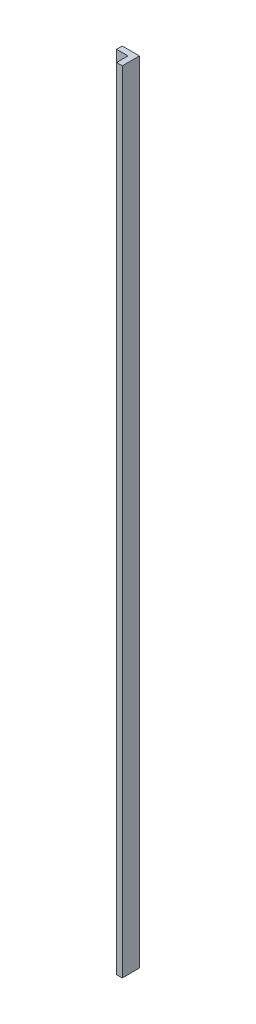
ISO-10303-21;
HEADER;
FILE_DESCRIPTION(('STEP AP214'),'2;1');
FILE_NAME('part.step','',(''),(''),'','','');
FILE_SCHEMA(('AUTOMOTIVE_DESIGN { 1 0 10303 214 1 1 1 1 }'));
ENDSEC;
DATA;
#1=APPLICATION_CONTEXT('core data for automotive mechanical design processes');
#2=APPLICATION_PROTOCOL_DEFINITION('international standard','automotive_design',2000,#1);
#3=PRODUCT_CONTEXT('',#1,'mechanical');
#4=PRODUCT('Part','Part','',(#3));
#5=PRODUCT_RELATED_PRODUCT_CATEGORY('part','',(#4));
#6=PRODUCT_DEFINITION_FORMATION('','',#4);
#7=PRODUCT_DEFINITION_CONTEXT('part definition',#1,'design');
#8=PRODUCT_DEFINITION('design','',#6,#7);
#9=PRODUCT_DEFINITION_SHAPE('','',#8);
#10=(LENGTH_UNIT() NAMED_UNIT(*) SI_UNIT(.MILLI.,.METRE.));
#11=(NAMED_UNIT(*) PLANE_ANGLE_UNIT() SI_UNIT($,.RADIAN.));
#12=(NAMED_UNIT(*) SI_UNIT($,.STERADIAN.) SOLID_ANGLE_UNIT());
#13=UNCERTAINTY_MEASURE_WITH_UNIT(LENGTH_MEASURE(1.E-05),#10,'distance_accuracy_value','');
#14=(GEOMETRIC_REPRESENTATION_CONTEXT(3) GLOBAL_UNCERTAINTY_ASSIGNED_CONTEXT((#13)) GLOBAL_UNIT_ASSIGNED_CONTEXT((#10,
#11,#12)) REPRESENTATION_CONTEXT('',''));
#15=CARTESIAN_POINT('',(0.,0.,0.));
#16=DIRECTION('',(0.,0.,1.));
#17=DIRECTION('',(1.,0.,0.));
#18=AXIS2_PLACEMENT_3D('',#15,#16,#17);
#19=CARTESIAN_POINT('',(0.,1380.,0.));
#20=DIRECTION('',(-1.,0.,0.));
#21=DIRECTION('',(0.,0.,1.));
#22=AXIS2_PLACEMENT_3D('',#19,#20,#21);
#23=PLANE('',#22);
#24=DIRECTION('',(0.,0.,-1.));
#25=VECTOR('',#24,1.);
#26=CARTESIAN_POINT('',(0.,0.,0.));
#27=LINE('',#26,#25);
#28=CARTESIAN_POINT('',(0.,0.,30.));
#29=VERTEX_POINT('',#28);
#30=CARTESIAN_POINT('',(0.,0.,0.));
#31=VERTEX_POINT('',#30);
#32=EDGE_CURVE('E124',#29,#31,#27,.T.);
#33=ORIENTED_EDGE('',*,*,#32,.T.);
#34=DIRECTION('',(0.,-1.,0.));
#35=VECTOR('',#34,1.);
#36=CARTESIAN_POINT('',(0.,1380.,0.));
#37=LINE('',#36,#35);
#38=CARTESIAN_POINT('',(0.,1380.,0.));
#39=VERTEX_POINT('',#38);
#40=EDGE_CURVE('E11',#39,#31,#37,.T.);
#41=ORIENTED_EDGE('',*,*,#40,.F.);
#42=DIRECTION('',(0.,0.,-1.));
#43=VECTOR('',#42,1.);
#44=CARTESIAN_POINT('',(0.,1380.,0.));
#45=LINE('',#44,#43);
#46=CARTESIAN_POINT('',(0.,1380.,30.));
#47=VERTEX_POINT('',#46);
#48=EDGE_CURVE('E134',#47,#39,#45,.T.);
#49=ORIENTED_EDGE('',*,*,#48,.F.);
#50=DIRECTION('',(0.,-1.,0.));
#51=VECTOR('',#50,1.);
#52=CARTESIAN_POINT('',(0.,1380.,30.));
#53=LINE('',#52,#51);
#54=EDGE_CURVE('E120',#47,#29,#53,.T.);
#55=ORIENTED_EDGE('',*,*,#54,.T.);
#56=EDGE_LOOP('',(#33,#41,#49,#55));
#57=FACE_BOUND('',#56,.T.);
#58=ADVANCED_FACE('F40',(#57),#23,.F.);
#59=CARTESIAN_POINT('',(0.,1380.,0.));
#60=DIRECTION('',(0.,0.,1.));
#61=DIRECTION('',(1.,0.,0.));
#62=AXIS2_PLACEMENT_3D('',#59,#60,#61);
#63=PLANE('',#62);
#64=DIRECTION('',(-1.,0.,0.));
#65=VECTOR('',#64,1.);
#66=CARTESIAN_POINT('',(0.,0.,0.));
#67=LINE('',#66,#65);
#68=CARTESIAN_POINT('',(-30.,0.,0.));
#69=VERTEX_POINT('',#68);
#70=EDGE_CURVE('E127',#31,#69,#67,.T.);
#71=ORIENTED_EDGE('',*,*,#70,.T.);
#72=DIRECTION('',(0.,-1.,0.));
#73=VECTOR('',#72,1.);
#74=CARTESIAN_POINT('',(-30.,1380.,0.));
#75=LINE('',#74,#73);
#76=CARTESIAN_POINT('',(-30.,1380.,0.));
#77=VERTEX_POINT('',#76);
#78=EDGE_CURVE('E48',#77,#69,#75,.T.);
#79=ORIENTED_EDGE('',*,*,#78,.F.);
#80=DIRECTION('',(-1.,0.,0.));
#81=VECTOR('',#80,1.);
#82=CARTESIAN_POINT('',(0.,1380.,0.));
#83=LINE('',#82,#81);
#84=EDGE_CURVE('E93',#39,#77,#83,.T.);
#85=ORIENTED_EDGE('',*,*,#84,.F.);
#86=ORIENTED_EDGE('',*,*,#40,.T.);
#87=EDGE_LOOP('',(#71,#79,#85,#86));
#88=FACE_BOUND('',#87,.T.);
#89=ADVANCED_FACE('F158',(#88),#63,.F.);
#90=CARTESIAN_POINT('',(-30.,1380.,10.));
#91=DIRECTION('',(1.,0.,0.));
#92=DIRECTION('',(0.,0.,-1.));
#93=AXIS2_PLACEMENT_3D('',#90,#91,#92);
#94=PLANE('',#93);
#95=DIRECTION('',(0.,0.,1.));
#96=VECTOR('',#95,1.);
#97=CARTESIAN_POINT('',(-30.,0.,10.));
#98=LINE('',#97,#96);
#99=CARTESIAN_POINT('',(-30.,0.,10.));
#100=VERTEX_POINT('',#99);
#101=EDGE_CURVE('E129',#69,#100,#98,.T.);
#102=ORIENTED_EDGE('',*,*,#101,.T.);
#103=DIRECTION('',(0.,-1.,0.));
#104=VECTOR('',#103,1.);
#105=CARTESIAN_POINT('',(-30.,1380.,10.));
#106=LINE('',#105,#104);
#107=CARTESIAN_POINT('',(-30.,1380.,10.));
#108=VERTEX_POINT('',#107);
#109=EDGE_CURVE('E115',#108,#100,#106,.T.);
#110=ORIENTED_EDGE('',*,*,#109,.F.);
#111=DIRECTION('',(0.,0.,1.));
#112=VECTOR('',#111,1.);
#113=CARTESIAN_POINT('',(-30.,1380.,10.));
#114=LINE('',#113,#112);
#115=EDGE_CURVE('E106',#77,#108,#114,.T.);
#116=ORIENTED_EDGE('',*,*,#115,.F.);
#117=ORIENTED_EDGE('',*,*,#78,.T.);
#118=EDGE_LOOP('',(#102,#110,#116,#117));
#119=FACE_BOUND('',#118,.T.);
#120=ADVANCED_FACE('F140',(#119),#94,.F.);
#121=CARTESIAN_POINT('',(-9.99999999999999,1380.,10.));
#122=DIRECTION('',(0.,0.,-1.));
#123=DIRECTION('',(-1.,0.,0.));
#124=AXIS2_PLACEMENT_3D('',#121,#122,#123);
#125=PLANE('',#124);
#126=DIRECTION('',(1.,0.,0.));
#127=VECTOR('',#126,1.);
#128=CARTESIAN_POINT('',(-9.99999999999999,0.,10.));
#129=LINE('',#128,#127);
#130=CARTESIAN_POINT('',(-9.99999999999999,0.,10.));
#131=VERTEX_POINT('',#130);
#132=EDGE_CURVE('E114',#100,#131,#129,.T.);
#133=ORIENTED_EDGE('',*,*,#132,.T.);
#134=DIRECTION('',(0.,-1.,0.));
#135=VECTOR('',#134,1.);
#136=CARTESIAN_POINT('',(-9.99999999999999,1380.,10.));
#137=LINE('',#136,#135);
#138=CARTESIAN_POINT('',(-9.99999999999999,1380.,10.));
#139=VERTEX_POINT('',#138);
#140=EDGE_CURVE('E111',#139,#131,#137,.T.);
#141=ORIENTED_EDGE('',*,*,#140,.F.);
#142=DIRECTION('',(1.,0.,0.));
#143=VECTOR('',#142,1.);
#144=CARTESIAN_POINT('',(-9.99999999999999,1380.,10.));
#145=LINE('',#144,#143);
#146=EDGE_CURVE('E100',#108,#139,#145,.T.);
#147=ORIENTED_EDGE('',*,*,#146,.F.);
#148=ORIENTED_EDGE('',*,*,#109,.T.);
#149=EDGE_LOOP('',(#133,#141,#147,#148));
#150=FACE_BOUND('',#149,.T.);
#151=ADVANCED_FACE('F112',(#150),#125,.F.);
#152=CARTESIAN_POINT('',(-9.99999999999999,1380.,30.));
#153=DIRECTION('',(1.,0.,0.));
#154=DIRECTION('',(0.,0.,-1.));
#155=AXIS2_PLACEMENT_3D('',#152,#153,#154);
#156=PLANE('',#155);
#157=DIRECTION('',(0.,0.,1.));
#158=VECTOR('',#157,1.);
#159=CARTESIAN_POINT('',(-9.99999999999999,0.,30.));
#160=LINE('',#159,#158);
#161=CARTESIAN_POINT('',(-9.99999999999999,0.,30.));
#162=VERTEX_POINT('',#161);
#163=EDGE_CURVE('E79',#131,#162,#160,.T.);
#164=ORIENTED_EDGE('',*,*,#163,.T.);
#165=DIRECTION('',(0.,-1.,0.));
#166=VECTOR('',#165,1.);
#167=CARTESIAN_POINT('',(-9.99999999999999,1380.,30.));
#168=LINE('',#167,#166);
#169=CARTESIAN_POINT('',(-9.99999999999999,1380.,30.));
#170=VERTEX_POINT('',#169);
#171=EDGE_CURVE('E116',#170,#162,#168,.T.);
#172=ORIENTED_EDGE('',*,*,#171,.F.);
#173=DIRECTION('',(0.,0.,1.));
#174=VECTOR('',#173,1.);
#175=CARTESIAN_POINT('',(-9.99999999999999,1380.,30.));
#176=LINE('',#175,#174);
#177=EDGE_CURVE('E104',#139,#170,#176,.T.);
#178=ORIENTED_EDGE('',*,*,#177,.F.);
#179=ORIENTED_EDGE('',*,*,#140,.T.);
#180=EDGE_LOOP('',(#164,#172,#178,#179));
#181=FACE_BOUND('',#180,.T.);
#182=ADVANCED_FACE('F118',(#181),#156,.F.);
#183=CARTESIAN_POINT('',(0.,1380.,30.));
#184=DIRECTION('',(0.,0.,-1.));
#185=DIRECTION('',(-1.,0.,0.));
#186=AXIS2_PLACEMENT_3D('',#183,#184,#185);
#187=PLANE('',#186);
#188=DIRECTION('',(1.,0.,0.));
#189=VECTOR('',#188,1.);
#190=CARTESIAN_POINT('',(0.,0.,30.));
#191=LINE('',#190,#189);
#192=EDGE_CURVE('E85',#162,#29,#191,.T.);
#193=ORIENTED_EDGE('',*,*,#192,.T.);
#194=ORIENTED_EDGE('',*,*,#54,.F.);
#195=DIRECTION('',(1.,0.,0.));
#196=VECTOR('',#195,1.);
#197=CARTESIAN_POINT('',(0.,1380.,30.));
#198=LINE('',#197,#196);
#199=EDGE_CURVE('E56',#170,#47,#198,.T.);
#200=ORIENTED_EDGE('',*,*,#199,.F.);
#201=ORIENTED_EDGE('',*,*,#171,.T.);
#202=EDGE_LOOP('',(#193,#194,#200,#201));
#203=FACE_BOUND('',#202,.T.);
#204=ADVANCED_FACE('F147',(#203),#187,.F.);
#205=CARTESIAN_POINT('',(0.,1380.,0.));
#206=DIRECTION('',(0.,-1.,0.));
#207=DIRECTION('',(0.,0.,-1.));
#208=AXIS2_PLACEMENT_3D('',#205,#206,#207);
#209=PLANE('',#208);
#210=ORIENTED_EDGE('',*,*,#48,.T.);
#211=ORIENTED_EDGE('',*,*,#84,.T.);
#212=ORIENTED_EDGE('',*,*,#115,.T.);
#213=ORIENTED_EDGE('',*,*,#146,.T.);
#214=ORIENTED_EDGE('',*,*,#177,.T.);
#215=ORIENTED_EDGE('',*,*,#199,.T.);
#216=EDGE_LOOP('',(#210,#211,#212,#213,#214,#215));
#217=FACE_BOUND('',#216,.T.);
#218=ADVANCED_FACE('F102',(#217),#209,.F.);
#219=CARTESIAN_POINT('',(0.,0.,0.));
#220=DIRECTION('',(0.,-1.,0.));
#221=DIRECTION('',(0.,0.,-1.));
#222=AXIS2_PLACEMENT_3D('',#219,#220,#221);
#223=PLANE('',#222);
#224=ORIENTED_EDGE('',*,*,#32,.F.);
#225=ORIENTED_EDGE('',*,*,#192,.F.);
#226=ORIENTED_EDGE('',*,*,#163,.F.);
#227=ORIENTED_EDGE('',*,*,#132,.F.);
#228=ORIENTED_EDGE('',*,*,#101,.F.);
#229=ORIENTED_EDGE('',*,*,#70,.F.);
#230=EDGE_LOOP('',(#224,#225,#226,#227,#228,#229));
#231=FACE_BOUND('',#230,.T.);
#232=ADVANCED_FACE('F143',(#231),#223,.T.);
#233=CLOSED_SHELL('',(#58,#89,#120,#151,#182,#204,#218,#232));
#234=MANIFOLD_SOLID_BREP('B2',#233);
#235=ADVANCED_BREP_SHAPE_REPRESENTATION('',(#18,#234),#14);
#236=SHAPE_DEFINITION_REPRESENTATION(#9,#235);
ENDSEC;
END-ISO-10303-21;
